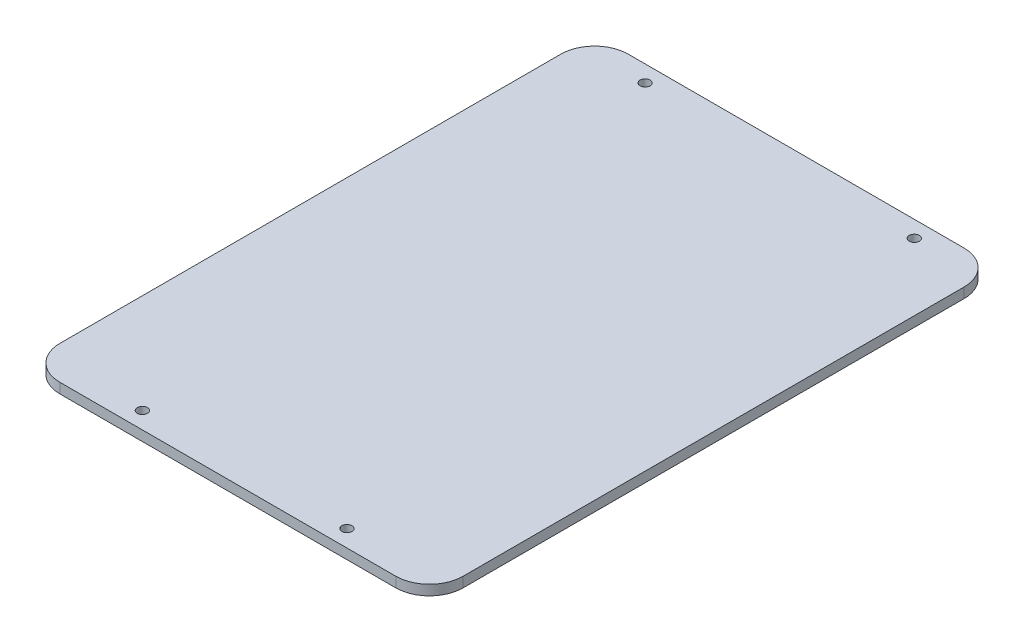
ISO-10303-21;
HEADER;
FILE_DESCRIPTION(('STEP AP214'),'2;1');
FILE_NAME('part.step','',(''),(''),'','','');
FILE_SCHEMA(('AUTOMOTIVE_DESIGN { 1 0 10303 214 1 1 1 1 }'));
ENDSEC;
DATA;
#1=APPLICATION_CONTEXT('core data for automotive mechanical design processes');
#2=APPLICATION_PROTOCOL_DEFINITION('international standard','automotive_design',2000,#1);
#3=PRODUCT_CONTEXT('',#1,'mechanical');
#4=PRODUCT('Part','Part','',(#3));
#5=PRODUCT_RELATED_PRODUCT_CATEGORY('part','',(#4));
#6=PRODUCT_DEFINITION_FORMATION('','',#4);
#7=PRODUCT_DEFINITION_CONTEXT('part definition',#1,'design');
#8=PRODUCT_DEFINITION('design','',#6,#7);
#9=PRODUCT_DEFINITION_SHAPE('','',#8);
#10=(LENGTH_UNIT() NAMED_UNIT(*) SI_UNIT(.MILLI.,.METRE.));
#11=(NAMED_UNIT(*) PLANE_ANGLE_UNIT() SI_UNIT($,.RADIAN.));
#12=(NAMED_UNIT(*) SI_UNIT($,.STERADIAN.) SOLID_ANGLE_UNIT());
#13=UNCERTAINTY_MEASURE_WITH_UNIT(LENGTH_MEASURE(1.E-05),#10,'distance_accuracy_value','');
#14=(GEOMETRIC_REPRESENTATION_CONTEXT(3) GLOBAL_UNCERTAINTY_ASSIGNED_CONTEXT((#13)) GLOBAL_UNIT_ASSIGNED_CONTEXT((#10,
#11,#12)) REPRESENTATION_CONTEXT('',''));
#15=CARTESIAN_POINT('',(0.,0.,0.));
#16=DIRECTION('',(0.,0.,1.));
#17=DIRECTION('',(1.,0.,0.));
#18=AXIS2_PLACEMENT_3D('',#15,#16,#17);
#19=CARTESIAN_POINT('',(109.7,3.,-10.));
#20=DIRECTION('',(0.,1.,0.));
#21=DIRECTION('',(0.,0.,1.));
#22=AXIS2_PLACEMENT_3D('',#19,#20,#21);
#23=PLANE('',#22);
#24=CARTESIAN_POINT('',(90.21,3.,-4.99));
#25=DIRECTION('',(0.,1.,0.));
#26=DIRECTION('',(0.,0.,-1.));
#27=AXIS2_PLACEMENT_3D('',#24,#25,#26);
#28=CIRCLE('',#27,1.5);
#29=CARTESIAN_POINT('',(90.21,3.,-6.49));
#30=VERTEX_POINT('',#29);
#31=EDGE_CURVE('E194',#30,#30,#28,.T.);
#32=ORIENTED_EDGE('',*,*,#31,.F.);
#33=EDGE_LOOP('',(#32));
#34=FACE_BOUND('',#33,.T.);
#35=CARTESIAN_POINT('',(19.9,3.,-163.81));
#36=DIRECTION('',(0.,1.,0.));
#37=DIRECTION('',(0.,0.,1.));
#38=AXIS2_PLACEMENT_3D('',#35,#36,#37);
#39=CIRCLE('',#38,1.5);
#40=CARTESIAN_POINT('',(19.9,3.,-162.31));
#41=VERTEX_POINT('',#40);
#42=EDGE_CURVE('E140',#41,#41,#39,.T.);
#43=ORIENTED_EDGE('',*,*,#42,.F.);
#44=EDGE_LOOP('',(#43));
#45=FACE_BOUND('',#44,.T.);
#46=CARTESIAN_POINT('',(109.7,3.,-10.));
#47=DIRECTION('',(0.,1.,0.));
#48=DIRECTION('',(0.,0.,1.));
#49=AXIS2_PLACEMENT_3D('',#46,#47,#48);
#50=CIRCLE('',#49,10.);
#51=CARTESIAN_POINT('',(109.7,3.,0.));
#52=VERTEX_POINT('',#51);
#53=CARTESIAN_POINT('',(119.7,3.,-10.));
#54=VERTEX_POINT('',#53);
#55=EDGE_CURVE('E151',#52,#54,#50,.T.);
#56=ORIENTED_EDGE('',*,*,#55,.T.);
#57=DIRECTION('',(0.,0.,-1.));
#58=VECTOR('',#57,1.);
#59=CARTESIAN_POINT('',(119.7,3.,-10.));
#60=LINE('',#59,#58);
#61=CARTESIAN_POINT('',(119.7,3.,-158.7));
#62=VERTEX_POINT('',#61);
#63=EDGE_CURVE('E99',#54,#62,#60,.T.);
#64=ORIENTED_EDGE('',*,*,#63,.T.);
#65=CARTESIAN_POINT('',(109.7,3.,-158.7));
#66=DIRECTION('',(0.,1.,0.));
#67=DIRECTION('',(0.,0.,-1.));
#68=AXIS2_PLACEMENT_3D('',#65,#66,#67);
#69=CIRCLE('',#68,9.99999999999999);
#70=CARTESIAN_POINT('',(109.7,3.,-168.7));
#71=VERTEX_POINT('',#70);
#72=EDGE_CURVE('E166',#62,#71,#69,.T.);
#73=ORIENTED_EDGE('',*,*,#72,.T.);
#74=DIRECTION('',(-1.,0.,0.));
#75=VECTOR('',#74,1.);
#76=CARTESIAN_POINT('',(10.,3.,-168.7));
#77=LINE('',#76,#75);
#78=CARTESIAN_POINT('',(10.,3.,-168.7));
#79=VERTEX_POINT('',#78);
#80=EDGE_CURVE('E179',#71,#79,#77,.T.);
#81=ORIENTED_EDGE('',*,*,#80,.T.);
#82=CARTESIAN_POINT('',(10.,3.,-158.7));
#83=DIRECTION('',(0.,1.,0.));
#84=DIRECTION('',(0.,0.,-1.));
#85=AXIS2_PLACEMENT_3D('',#82,#83,#84);
#86=CIRCLE('',#85,9.99999999999999);
#87=CARTESIAN_POINT('',(0.,3.,-158.7));
#88=VERTEX_POINT('',#87);
#89=EDGE_CURVE('E118',#79,#88,#86,.T.);
#90=ORIENTED_EDGE('',*,*,#89,.T.);
#91=DIRECTION('',(0.,0.,1.));
#92=VECTOR('',#91,1.);
#93=CARTESIAN_POINT('',(0.,3.,-10.0000000000001));
#94=LINE('',#93,#92);
#95=CARTESIAN_POINT('',(0.,3.,-10.0000000000001));
#96=VERTEX_POINT('',#95);
#97=EDGE_CURVE('E112',#88,#96,#94,.T.);
#98=ORIENTED_EDGE('',*,*,#97,.T.);
#99=CARTESIAN_POINT('',(10.,3.,-10.));
#100=DIRECTION('',(0.,1.,0.));
#101=DIRECTION('',(0.,0.,-1.));
#102=AXIS2_PLACEMENT_3D('',#99,#100,#101);
#103=CIRCLE('',#102,10.);
#104=CARTESIAN_POINT('',(10.0000000000001,3.,0.));
#105=VERTEX_POINT('',#104);
#106=EDGE_CURVE('E116',#96,#105,#103,.T.);
#107=ORIENTED_EDGE('',*,*,#106,.T.);
#108=DIRECTION('',(1.,0.,0.));
#109=VECTOR('',#108,1.);
#110=CARTESIAN_POINT('',(10.0000000000001,3.,0.));
#111=LINE('',#110,#109);
#112=EDGE_CURVE('E56',#105,#52,#111,.T.);
#113=ORIENTED_EDGE('',*,*,#112,.T.);
#114=EDGE_LOOP('',(#56,#64,#73,#81,#90,#98,#107,#113));
#115=FACE_BOUND('',#114,.T.);
#116=CARTESIAN_POINT('',(29.49,3.,-4.98999999999999));
#117=DIRECTION('',(0.,1.,0.));
#118=DIRECTION('',(0.,0.,1.));
#119=AXIS2_PLACEMENT_3D('',#116,#117,#118);
#120=CIRCLE('',#119,1.5);
#121=CARTESIAN_POINT('',(29.49,3.,-3.48999999999999));
#122=VERTEX_POINT('',#121);
#123=EDGE_CURVE('E188',#122,#122,#120,.T.);
#124=ORIENTED_EDGE('',*,*,#123,.F.);
#125=EDGE_LOOP('',(#124));
#126=FACE_BOUND('',#125,.T.);
#127=CARTESIAN_POINT('',(99.8,3.,-163.81));
#128=DIRECTION('',(0.,1.,0.));
#129=DIRECTION('',(0.,0.,-1.));
#130=AXIS2_PLACEMENT_3D('',#127,#128,#129);
#131=CIRCLE('',#130,1.5);
#132=CARTESIAN_POINT('',(99.8,3.,-165.31));
#133=VERTEX_POINT('',#132);
#134=EDGE_CURVE('E200',#133,#133,#131,.T.);
#135=ORIENTED_EDGE('',*,*,#134,.F.);
#136=EDGE_LOOP('',(#135));
#137=FACE_BOUND('',#136,.T.);
#138=ADVANCED_FACE('F39',(#34,#45,#115,#126,#137),#23,.T.);
#139=CARTESIAN_POINT('',(109.7,0.,-10.));
#140=DIRECTION('',(0.,1.,0.));
#141=DIRECTION('',(0.,0.,1.));
#142=AXIS2_PLACEMENT_3D('',#139,#140,#141);
#143=PLANE('',#142);
#144=CARTESIAN_POINT('',(109.7,0.,-10.));
#145=DIRECTION('',(0.,1.,0.));
#146=DIRECTION('',(0.,0.,1.));
#147=AXIS2_PLACEMENT_3D('',#144,#145,#146);
#148=CIRCLE('',#147,10.);
#149=CARTESIAN_POINT('',(109.7,0.,0.));
#150=VERTEX_POINT('',#149);
#151=CARTESIAN_POINT('',(119.7,0.,-10.));
#152=VERTEX_POINT('',#151);
#153=EDGE_CURVE('E136',#150,#152,#148,.T.);
#154=ORIENTED_EDGE('',*,*,#153,.F.);
#155=DIRECTION('',(1.,0.,0.));
#156=VECTOR('',#155,1.);
#157=CARTESIAN_POINT('',(10.0000000000001,0.,0.));
#158=LINE('',#157,#156);
#159=CARTESIAN_POINT('',(10.0000000000001,0.,0.));
#160=VERTEX_POINT('',#159);
#161=EDGE_CURVE('E91',#160,#150,#158,.T.);
#162=ORIENTED_EDGE('',*,*,#161,.F.);
#163=CARTESIAN_POINT('',(10.,0.,-10.));
#164=DIRECTION('',(0.,1.,0.));
#165=DIRECTION('',(0.,0.,-1.));
#166=AXIS2_PLACEMENT_3D('',#163,#164,#165);
#167=CIRCLE('',#166,10.);
#168=CARTESIAN_POINT('',(0.,0.,-10.0000000000001));
#169=VERTEX_POINT('',#168);
#170=EDGE_CURVE('E85',#169,#160,#167,.T.);
#171=ORIENTED_EDGE('',*,*,#170,.F.);
#172=DIRECTION('',(0.,0.,1.));
#173=VECTOR('',#172,1.);
#174=CARTESIAN_POINT('',(0.,0.,-10.0000000000001));
#175=LINE('',#174,#173);
#176=CARTESIAN_POINT('',(0.,0.,-158.7));
#177=VERTEX_POINT('',#176);
#178=EDGE_CURVE('E126',#177,#169,#175,.T.);
#179=ORIENTED_EDGE('',*,*,#178,.F.);
#180=CARTESIAN_POINT('',(10.,0.,-158.7));
#181=DIRECTION('',(0.,1.,0.));
#182=DIRECTION('',(0.,0.,-1.));
#183=AXIS2_PLACEMENT_3D('',#180,#181,#182);
#184=CIRCLE('',#183,9.99999999999999);
#185=CARTESIAN_POINT('',(10.,0.,-168.7));
#186=VERTEX_POINT('',#185);
#187=EDGE_CURVE('E146',#186,#177,#184,.T.);
#188=ORIENTED_EDGE('',*,*,#187,.F.);
#189=DIRECTION('',(-1.,0.,0.));
#190=VECTOR('',#189,1.);
#191=CARTESIAN_POINT('',(10.,0.,-168.7));
#192=LINE('',#191,#190);
#193=CARTESIAN_POINT('',(109.7,0.,-168.7));
#194=VERTEX_POINT('',#193);
#195=EDGE_CURVE('E144',#194,#186,#192,.T.);
#196=ORIENTED_EDGE('',*,*,#195,.F.);
#197=CARTESIAN_POINT('',(109.7,0.,-158.7));
#198=DIRECTION('',(0.,1.,0.));
#199=DIRECTION('',(0.,0.,-1.));
#200=AXIS2_PLACEMENT_3D('',#197,#198,#199);
#201=CIRCLE('',#200,9.99999999999999);
#202=CARTESIAN_POINT('',(119.7,0.,-158.7));
#203=VERTEX_POINT('',#202);
#204=EDGE_CURVE('E142',#203,#194,#201,.T.);
#205=ORIENTED_EDGE('',*,*,#204,.F.);
#206=DIRECTION('',(0.,0.,-1.));
#207=VECTOR('',#206,1.);
#208=CARTESIAN_POINT('',(119.7,0.,-10.));
#209=LINE('',#208,#207);
#210=EDGE_CURVE('E139',#152,#203,#209,.T.);
#211=ORIENTED_EDGE('',*,*,#210,.F.);
#212=EDGE_LOOP('',(#154,#162,#171,#179,#188,#196,#205,#211));
#213=FACE_BOUND('',#212,.T.);
#214=CARTESIAN_POINT('',(19.9,0.,-163.81));
#215=DIRECTION('',(0.,1.,0.));
#216=DIRECTION('',(0.,0.,1.));
#217=AXIS2_PLACEMENT_3D('',#214,#215,#216);
#218=CIRCLE('',#217,1.5);
#219=CARTESIAN_POINT('',(19.9,0.,-162.31));
#220=VERTEX_POINT('',#219);
#221=EDGE_CURVE('E185',#220,#220,#218,.T.);
#222=ORIENTED_EDGE('',*,*,#221,.T.);
#223=EDGE_LOOP('',(#222));
#224=FACE_BOUND('',#223,.T.);
#225=CARTESIAN_POINT('',(29.49,0.,-4.98999999999999));
#226=DIRECTION('',(0.,1.,0.));
#227=DIRECTION('',(0.,0.,1.));
#228=AXIS2_PLACEMENT_3D('',#225,#226,#227);
#229=CIRCLE('',#228,1.5);
#230=CARTESIAN_POINT('',(29.49,0.,-3.48999999999999));
#231=VERTEX_POINT('',#230);
#232=EDGE_CURVE('E191',#231,#231,#229,.T.);
#233=ORIENTED_EDGE('',*,*,#232,.T.);
#234=EDGE_LOOP('',(#233));
#235=FACE_BOUND('',#234,.T.);
#236=CARTESIAN_POINT('',(90.21,0.,-4.99));
#237=DIRECTION('',(0.,1.,0.));
#238=DIRECTION('',(0.,0.,-1.));
#239=AXIS2_PLACEMENT_3D('',#236,#237,#238);
#240=CIRCLE('',#239,1.5);
#241=CARTESIAN_POINT('',(90.21,0.,-6.49));
#242=VERTEX_POINT('',#241);
#243=EDGE_CURVE('E197',#242,#242,#240,.T.);
#244=ORIENTED_EDGE('',*,*,#243,.T.);
#245=EDGE_LOOP('',(#244));
#246=FACE_BOUND('',#245,.T.);
#247=CARTESIAN_POINT('',(99.8,0.,-163.81));
#248=DIRECTION('',(0.,1.,0.));
#249=DIRECTION('',(0.,0.,-1.));
#250=AXIS2_PLACEMENT_3D('',#247,#248,#249);
#251=CIRCLE('',#250,1.5);
#252=CARTESIAN_POINT('',(99.8,0.,-165.31));
#253=VERTEX_POINT('',#252);
#254=EDGE_CURVE('E203',#253,#253,#251,.T.);
#255=ORIENTED_EDGE('',*,*,#254,.T.);
#256=EDGE_LOOP('',(#255));
#257=FACE_BOUND('',#256,.T.);
#258=ADVANCED_FACE('F170',(#213,#224,#235,#246,#257),#143,.F.);
#259=CARTESIAN_POINT('',(109.7,3.,-10.));
#260=DIRECTION('',(0.,-1.,0.));
#261=DIRECTION('',(0.,0.,-1.));
#262=AXIS2_PLACEMENT_3D('',#259,#260,#261);
#263=CYLINDRICAL_SURFACE('',#262,10.);
#264=ORIENTED_EDGE('',*,*,#153,.T.);
#265=DIRECTION('',(0.,-1.,0.));
#266=VECTOR('',#265,1.);
#267=CARTESIAN_POINT('',(119.7,3.,-10.));
#268=LINE('',#267,#266);
#269=EDGE_CURVE('E11',#54,#152,#268,.T.);
#270=ORIENTED_EDGE('',*,*,#269,.F.);
#271=ORIENTED_EDGE('',*,*,#55,.F.);
#272=DIRECTION('',(0.,-1.,0.));
#273=VECTOR('',#272,1.);
#274=CARTESIAN_POINT('',(109.7,3.,0.));
#275=LINE('',#274,#273);
#276=EDGE_CURVE('E132',#52,#150,#275,.T.);
#277=ORIENTED_EDGE('',*,*,#276,.T.);
#278=EDGE_LOOP('',(#264,#270,#271,#277));
#279=FACE_BOUND('',#278,.T.);
#280=ADVANCED_FACE('F41',(#279),#263,.T.);
#281=CARTESIAN_POINT('',(119.7,3.,-10.));
#282=DIRECTION('',(-1.,0.,0.));
#283=DIRECTION('',(0.,0.,1.));
#284=AXIS2_PLACEMENT_3D('',#281,#282,#283);
#285=PLANE('',#284);
#286=ORIENTED_EDGE('',*,*,#210,.T.);
#287=DIRECTION('',(0.,-1.,0.));
#288=VECTOR('',#287,1.);
#289=CARTESIAN_POINT('',(119.7,3.,-158.7));
#290=LINE('',#289,#288);
#291=EDGE_CURVE('E48',#62,#203,#290,.T.);
#292=ORIENTED_EDGE('',*,*,#291,.F.);
#293=ORIENTED_EDGE('',*,*,#63,.F.);
#294=ORIENTED_EDGE('',*,*,#269,.T.);
#295=EDGE_LOOP('',(#286,#292,#293,#294));
#296=FACE_BOUND('',#295,.T.);
#297=ADVANCED_FACE('F237',(#296),#285,.F.);
#298=CARTESIAN_POINT('',(109.7,3.,-158.7));
#299=DIRECTION('',(0.,-1.,0.));
#300=DIRECTION('',(0.,0.,-1.));
#301=AXIS2_PLACEMENT_3D('',#298,#299,#300);
#302=CYLINDRICAL_SURFACE('',#301,9.99999999999999);
#303=ORIENTED_EDGE('',*,*,#204,.T.);
#304=DIRECTION('',(0.,-1.,0.));
#305=VECTOR('',#304,1.);
#306=CARTESIAN_POINT('',(109.7,3.,-168.7));
#307=LINE('',#306,#305);
#308=EDGE_CURVE('E158',#71,#194,#307,.T.);
#309=ORIENTED_EDGE('',*,*,#308,.F.);
#310=ORIENTED_EDGE('',*,*,#72,.F.);
#311=ORIENTED_EDGE('',*,*,#291,.T.);
#312=EDGE_LOOP('',(#303,#309,#310,#311));
#313=FACE_BOUND('',#312,.T.);
#314=ADVANCED_FACE('F164',(#313),#302,.T.);
#315=CARTESIAN_POINT('',(10.,3.,-168.7));
#316=DIRECTION('',(0.,0.,1.));
#317=DIRECTION('',(1.,0.,0.));
#318=AXIS2_PLACEMENT_3D('',#315,#316,#317);
#319=PLANE('',#318);
#320=ORIENTED_EDGE('',*,*,#195,.T.);
#321=DIRECTION('',(0.,-1.,0.));
#322=VECTOR('',#321,1.);
#323=CARTESIAN_POINT('',(10.,3.,-168.7));
#324=LINE('',#323,#322);
#325=EDGE_CURVE('E155',#79,#186,#324,.T.);
#326=ORIENTED_EDGE('',*,*,#325,.F.);
#327=ORIENTED_EDGE('',*,*,#80,.F.);
#328=ORIENTED_EDGE('',*,*,#308,.T.);
#329=EDGE_LOOP('',(#320,#326,#327,#328));
#330=FACE_BOUND('',#329,.T.);
#331=ADVANCED_FACE('F175',(#330),#319,.F.);
#332=CARTESIAN_POINT('',(10.,3.,-158.7));
#333=DIRECTION('',(0.,-1.,0.));
#334=DIRECTION('',(0.,0.,-1.));
#335=AXIS2_PLACEMENT_3D('',#332,#333,#334);
#336=CYLINDRICAL_SURFACE('',#335,9.99999999999999);
#337=ORIENTED_EDGE('',*,*,#187,.T.);
#338=DIRECTION('',(0.,-1.,0.));
#339=VECTOR('',#338,1.);
#340=CARTESIAN_POINT('',(0.,3.,-158.7));
#341=LINE('',#340,#339);
#342=EDGE_CURVE('E127',#88,#177,#341,.T.);
#343=ORIENTED_EDGE('',*,*,#342,.F.);
#344=ORIENTED_EDGE('',*,*,#89,.F.);
#345=ORIENTED_EDGE('',*,*,#325,.T.);
#346=EDGE_LOOP('',(#337,#343,#344,#345));
#347=FACE_BOUND('',#346,.T.);
#348=ADVANCED_FACE('F178',(#347),#336,.T.);
#349=CARTESIAN_POINT('',(0.,3.,-10.0000000000001));
#350=DIRECTION('',(1.,0.,0.));
#351=DIRECTION('',(0.,0.,-1.));
#352=AXIS2_PLACEMENT_3D('',#349,#350,#351);
#353=PLANE('',#352);
#354=ORIENTED_EDGE('',*,*,#178,.T.);
#355=DIRECTION('',(0.,-1.,0.));
#356=VECTOR('',#355,1.);
#357=CARTESIAN_POINT('',(0.,3.,-10.0000000000001));
#358=LINE('',#357,#356);
#359=EDGE_CURVE('E123',#96,#169,#358,.T.);
#360=ORIENTED_EDGE('',*,*,#359,.F.);
#361=ORIENTED_EDGE('',*,*,#97,.F.);
#362=ORIENTED_EDGE('',*,*,#342,.T.);
#363=EDGE_LOOP('',(#354,#360,#361,#362));
#364=FACE_BOUND('',#363,.T.);
#365=ADVANCED_FACE('F124',(#364),#353,.F.);
#366=CARTESIAN_POINT('',(10.,3.,-10.));
#367=DIRECTION('',(0.,-1.,0.));
#368=DIRECTION('',(0.,0.,-1.));
#369=AXIS2_PLACEMENT_3D('',#366,#367,#368);
#370=CYLINDRICAL_SURFACE('',#369,10.);
#371=ORIENTED_EDGE('',*,*,#170,.T.);
#372=DIRECTION('',(0.,-1.,0.));
#373=VECTOR('',#372,1.);
#374=CARTESIAN_POINT('',(10.0000000000001,3.,0.));
#375=LINE('',#374,#373);
#376=EDGE_CURVE('E128',#105,#160,#375,.T.);
#377=ORIENTED_EDGE('',*,*,#376,.F.);
#378=ORIENTED_EDGE('',*,*,#106,.F.);
#379=ORIENTED_EDGE('',*,*,#359,.T.);
#380=EDGE_LOOP('',(#371,#377,#378,#379));
#381=FACE_BOUND('',#380,.T.);
#382=ADVANCED_FACE('F130',(#381),#370,.T.);
#383=CARTESIAN_POINT('',(10.0000000000001,3.,0.));
#384=DIRECTION('',(0.,0.,-1.));
#385=DIRECTION('',(-1.,0.,0.));
#386=AXIS2_PLACEMENT_3D('',#383,#384,#385);
#387=PLANE('',#386);
#388=ORIENTED_EDGE('',*,*,#161,.T.);
#389=ORIENTED_EDGE('',*,*,#276,.F.);
#390=ORIENTED_EDGE('',*,*,#112,.F.);
#391=ORIENTED_EDGE('',*,*,#376,.T.);
#392=EDGE_LOOP('',(#388,#389,#390,#391));
#393=FACE_BOUND('',#392,.T.);
#394=ADVANCED_FACE('F225',(#393),#387,.F.);
#395=CARTESIAN_POINT('',(19.9,3.,-163.81));
#396=DIRECTION('',(0.,-1.,0.));
#397=DIRECTION('',(0.,0.,-1.));
#398=AXIS2_PLACEMENT_3D('',#395,#396,#397);
#399=CYLINDRICAL_SURFACE('',#398,1.5);
#400=ORIENTED_EDGE('',*,*,#42,.T.);
#401=EDGE_LOOP('',(#400));
#402=FACE_BOUND('',#401,.T.);
#403=ORIENTED_EDGE('',*,*,#221,.F.);
#404=EDGE_LOOP('',(#403));
#405=FACE_BOUND('',#404,.T.);
#406=ADVANCED_FACE('F222',(#402,#405),#399,.F.);
#407=CARTESIAN_POINT('',(29.49,3.,-4.98999999999999));
#408=DIRECTION('',(0.,-1.,0.));
#409=DIRECTION('',(0.,0.,-1.));
#410=AXIS2_PLACEMENT_3D('',#407,#408,#409);
#411=CYLINDRICAL_SURFACE('',#410,1.5);
#412=ORIENTED_EDGE('',*,*,#123,.T.);
#413=EDGE_LOOP('',(#412));
#414=FACE_BOUND('',#413,.T.);
#415=ORIENTED_EDGE('',*,*,#232,.F.);
#416=EDGE_LOOP('',(#415));
#417=FACE_BOUND('',#416,.T.);
#418=ADVANCED_FACE('F300',(#414,#417),#411,.F.);
#419=CARTESIAN_POINT('',(90.21,3.,-4.99));
#420=DIRECTION('',(0.,-1.,0.));
#421=DIRECTION('',(0.,0.,-1.));
#422=AXIS2_PLACEMENT_3D('',#419,#420,#421);
#423=CYLINDRICAL_SURFACE('',#422,1.5);
#424=ORIENTED_EDGE('',*,*,#31,.T.);
#425=EDGE_LOOP('',(#424));
#426=FACE_BOUND('',#425,.T.);
#427=ORIENTED_EDGE('',*,*,#243,.F.);
#428=EDGE_LOOP('',(#427));
#429=FACE_BOUND('',#428,.T.);
#430=ADVANCED_FACE('F308',(#426,#429),#423,.F.);
#431=CARTESIAN_POINT('',(99.8,3.,-163.81));
#432=DIRECTION('',(0.,-1.,0.));
#433=DIRECTION('',(0.,0.,-1.));
#434=AXIS2_PLACEMENT_3D('',#431,#432,#433);
#435=CYLINDRICAL_SURFACE('',#434,1.5);
#436=ORIENTED_EDGE('',*,*,#134,.T.);
#437=EDGE_LOOP('',(#436));
#438=FACE_BOUND('',#437,.T.);
#439=ORIENTED_EDGE('',*,*,#254,.F.);
#440=EDGE_LOOP('',(#439));
#441=FACE_BOUND('',#440,.T.);
#442=ADVANCED_FACE('F209',(#438,#441),#435,.F.);
#443=CLOSED_SHELL('',(#138,#258,#280,#297,#314,#331,#348,#365,#382,#394,#406,#418,#430,#442));
#444=MANIFOLD_SOLID_BREP('B2',#443);
#445=ADVANCED_BREP_SHAPE_REPRESENTATION('',(#18,#444),#14);
#446=SHAPE_DEFINITION_REPRESENTATION(#9,#445);
ENDSEC;
END-ISO-10303-21;
